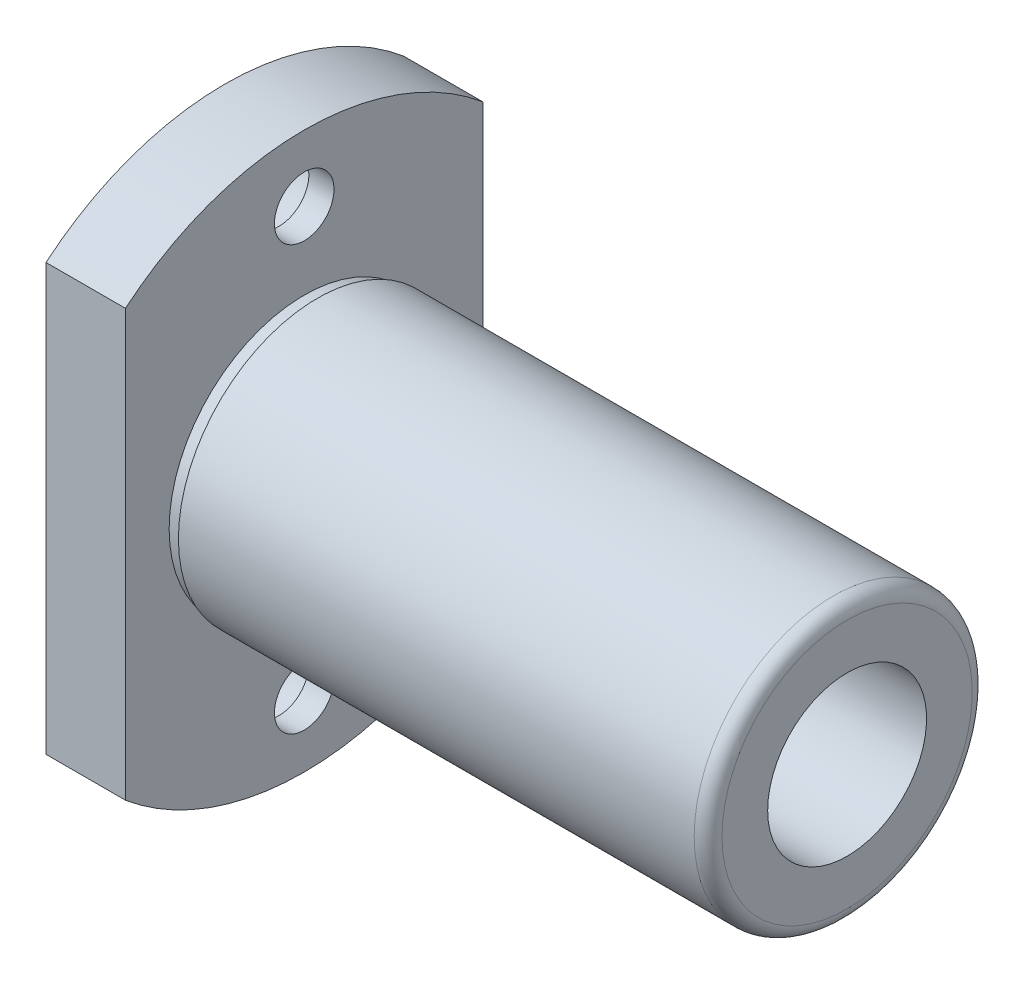
ISO-10303-21;
HEADER;
FILE_DESCRIPTION(('STEP AP214'),'2;1');
FILE_NAME('part.step','',(''),(''),'','','');
FILE_SCHEMA(('AUTOMOTIVE_DESIGN { 1 0 10303 214 1 1 1 1 }'));
ENDSEC;
DATA;
#1=APPLICATION_CONTEXT('core data for automotive mechanical design processes');
#2=APPLICATION_PROTOCOL_DEFINITION('international standard','automotive_design',2000,#1);
#3=PRODUCT_CONTEXT('',#1,'mechanical');
#4=PRODUCT('Part','Part','',(#3));
#5=PRODUCT_RELATED_PRODUCT_CATEGORY('part','',(#4));
#6=PRODUCT_DEFINITION_FORMATION('','',#4);
#7=PRODUCT_DEFINITION_CONTEXT('part definition',#1,'design');
#8=PRODUCT_DEFINITION('design','',#6,#7);
#9=PRODUCT_DEFINITION_SHAPE('','',#8);
#10=(LENGTH_UNIT() NAMED_UNIT(*) SI_UNIT(.MILLI.,.METRE.));
#11=(NAMED_UNIT(*) PLANE_ANGLE_UNIT() SI_UNIT($,.RADIAN.));
#12=(NAMED_UNIT(*) SI_UNIT($,.STERADIAN.) SOLID_ANGLE_UNIT());
#13=UNCERTAINTY_MEASURE_WITH_UNIT(LENGTH_MEASURE(1.E-05),#10,'distance_accuracy_value','');
#14=(GEOMETRIC_REPRESENTATION_CONTEXT(3) GLOBAL_UNCERTAINTY_ASSIGNED_CONTEXT((#13)) GLOBAL_UNIT_ASSIGNED_CONTEXT((#10,
#11,#12)) REPRESENTATION_CONTEXT('',''));
#15=CARTESIAN_POINT('',(0.,0.,0.));
#16=DIRECTION('',(0.,0.,1.));
#17=DIRECTION('',(1.,0.,0.));
#18=AXIS2_PLACEMENT_3D('',#15,#16,#17);
#19=CARTESIAN_POINT('',(0.,21.,0.));
#20=DIRECTION('',(1.,0.,0.));
#21=DIRECTION('',(0.,0.,-1.));
#22=AXIS2_PLACEMENT_3D('',#19,#20,#21);
#23=PLANE('',#22);
#24=CARTESIAN_POINT('',(0.,16.,0.));
#25=DIRECTION('',(-1.,0.,0.));
#26=DIRECTION('',(0.,0.,1.));
#27=AXIS2_PLACEMENT_3D('',#24,#25,#26);
#28=CIRCLE('',#27,3.75);
#29=CARTESIAN_POINT('',(0.,16.,3.75));
#30=VERTEX_POINT('',#29);
#31=EDGE_CURVE('E121',#30,#30,#28,.T.);
#32=ORIENTED_EDGE('',*,*,#31,.F.);
#33=EDGE_LOOP('',(#32));
#34=FACE_BOUND('',#33,.T.);
#35=CARTESIAN_POINT('',(0.,0.,0.));
#36=DIRECTION('',(-1.,0.,0.));
#37=DIRECTION('',(0.,0.,1.));
#38=AXIS2_PLACEMENT_3D('',#35,#36,#37);
#39=CIRCLE('',#38,6.);
#40=CARTESIAN_POINT('',(0.,0.,6.));
#41=VERTEX_POINT('',#40);
#42=EDGE_CURVE('E112',#41,#41,#39,.T.);
#43=ORIENTED_EDGE('',*,*,#42,.F.);
#44=EDGE_LOOP('',(#43));
#45=FACE_BOUND('',#44,.T.);
#46=CARTESIAN_POINT('',(0.,0.,0.));
#47=DIRECTION('',(-1.,0.,0.));
#48=DIRECTION('',(0.,0.,1.));
#49=AXIS2_PLACEMENT_3D('',#46,#47,#48);
#50=CIRCLE('',#49,21.);
#51=CARTESIAN_POINT('',(0.,16.085707942145,13.5));
#52=VERTEX_POINT('',#51);
#53=CARTESIAN_POINT('',(0.,16.085707942145,-13.5));
#54=VERTEX_POINT('',#53);
#55=EDGE_CURVE('E11',#52,#54,#50,.T.);
#56=ORIENTED_EDGE('',*,*,#55,.T.);
#57=DIRECTION('',(0.,1.,0.));
#58=VECTOR('',#57,1.);
#59=CARTESIAN_POINT('',(0.,-16.085707942145,-13.5));
#60=LINE('',#59,#58);
#61=CARTESIAN_POINT('',(0.,-16.085707942145,-13.5));
#62=VERTEX_POINT('',#61);
#63=EDGE_CURVE('E120',#62,#54,#60,.T.);
#64=ORIENTED_EDGE('',*,*,#63,.F.);
#65=CARTESIAN_POINT('',(0.,-16.085707942145,13.5));
#66=VERTEX_POINT('',#65);
#67=EDGE_CURVE('E41',#62,#66,#50,.T.);
#68=ORIENTED_EDGE('',*,*,#67,.T.);
#69=DIRECTION('',(0.,-1.,0.));
#70=VECTOR('',#69,1.);
#71=CARTESIAN_POINT('',(0.,16.085707942145,13.5));
#72=LINE('',#71,#70);
#73=EDGE_CURVE('E81',#52,#66,#72,.T.);
#74=ORIENTED_EDGE('',*,*,#73,.F.);
#75=EDGE_LOOP('',(#56,#64,#68,#74));
#76=FACE_BOUND('',#75,.T.);
#77=CARTESIAN_POINT('',(0.,-16.,0.));
#78=DIRECTION('',(-1.,0.,0.));
#79=DIRECTION('',(0.,0.,1.));
#80=AXIS2_PLACEMENT_3D('',#77,#78,#79);
#81=CIRCLE('',#80,3.75);
#82=CARTESIAN_POINT('',(0.,-16.,3.75));
#83=VERTEX_POINT('',#82);
#84=EDGE_CURVE('E305',#83,#83,#81,.T.);
#85=ORIENTED_EDGE('',*,*,#84,.F.);
#86=EDGE_LOOP('',(#85));
#87=FACE_BOUND('',#86,.T.);
#88=ADVANCED_FACE('F33',(#34,#45,#76,#87),#23,.F.);
#89=CARTESIAN_POINT('',(6.,10.2,0.));
#90=DIRECTION('',(-1.,0.,0.));
#91=DIRECTION('',(0.,0.,1.));
#92=AXIS2_PLACEMENT_3D('',#89,#90,#91);
#93=PLANE('',#92);
#94=CARTESIAN_POINT('',(6.,16.,0.));
#95=DIRECTION('',(-1.,0.,0.));
#96=DIRECTION('',(0.,0.,1.));
#97=AXIS2_PLACEMENT_3D('',#94,#95,#96);
#98=CIRCLE('',#97,2.25);
#99=CARTESIAN_POINT('',(6.,16.,2.25));
#100=VERTEX_POINT('',#99);
#101=EDGE_CURVE('E308',#100,#100,#98,.T.);
#102=ORIENTED_EDGE('',*,*,#101,.T.);
#103=EDGE_LOOP('',(#102));
#104=FACE_BOUND('',#103,.T.);
#105=CARTESIAN_POINT('',(6.,0.,0.));
#106=DIRECTION('',(-1.,0.,0.));
#107=DIRECTION('',(0.,0.,1.));
#108=AXIS2_PLACEMENT_3D('',#105,#106,#107);
#109=CIRCLE('',#108,21.);
#110=CARTESIAN_POINT('',(6.,-16.085707942145,-13.5));
#111=VERTEX_POINT('',#110);
#112=CARTESIAN_POINT('',(6.,-16.0857079421454,13.5));
#113=VERTEX_POINT('',#112);
#114=EDGE_CURVE('E86',#111,#113,#109,.T.);
#115=ORIENTED_EDGE('',*,*,#114,.F.);
#116=DIRECTION('',(0.,1.,0.));
#117=VECTOR('',#116,1.);
#118=CARTESIAN_POINT('',(6.,-16.085707942145,-13.5));
#119=LINE('',#118,#117);
#120=CARTESIAN_POINT('',(6.,16.0857079421452,-13.5000000000002));
#121=VERTEX_POINT('',#120);
#122=EDGE_CURVE('E71',#111,#121,#119,.T.);
#123=ORIENTED_EDGE('',*,*,#122,.T.);
#124=CARTESIAN_POINT('',(6.,16.085707942145,13.5));
#125=VERTEX_POINT('',#124);
#126=EDGE_CURVE('E91',#125,#121,#109,.T.);
#127=ORIENTED_EDGE('',*,*,#126,.F.);
#128=DIRECTION('',(0.,-1.,0.));
#129=VECTOR('',#128,1.);
#130=CARTESIAN_POINT('',(6.,16.085707942145,13.5));
#131=LINE('',#130,#129);
#132=EDGE_CURVE('E80',#125,#113,#131,.T.);
#133=ORIENTED_EDGE('',*,*,#132,.T.);
#134=EDGE_LOOP('',(#115,#123,#127,#133));
#135=FACE_BOUND('',#134,.T.);
#136=CARTESIAN_POINT('',(6.,0.,0.));
#137=DIRECTION('',(-1.,0.,0.));
#138=DIRECTION('',(0.,0.,1.));
#139=AXIS2_PLACEMENT_3D('',#136,#137,#138);
#140=CIRCLE('',#139,10.2);
#141=CARTESIAN_POINT('',(6.,0.,10.2));
#142=VERTEX_POINT('',#141);
#143=EDGE_CURVE('E93',#142,#142,#140,.T.);
#144=ORIENTED_EDGE('',*,*,#143,.T.);
#145=EDGE_LOOP('',(#144));
#146=FACE_BOUND('',#145,.T.);
#147=CARTESIAN_POINT('',(6.,-16.,0.));
#148=DIRECTION('',(-1.,0.,0.));
#149=DIRECTION('',(0.,0.,1.));
#150=AXIS2_PLACEMENT_3D('',#147,#148,#149);
#151=CIRCLE('',#150,2.25);
#152=CARTESIAN_POINT('',(6.,-16.,2.25));
#153=VERTEX_POINT('',#152);
#154=EDGE_CURVE('E297',#153,#153,#151,.T.);
#155=ORIENTED_EDGE('',*,*,#154,.T.);
#156=EDGE_LOOP('',(#155));
#157=FACE_BOUND('',#156,.T.);
#158=ADVANCED_FACE('F89',(#104,#135,#146,#157),#93,.F.);
#159=CARTESIAN_POINT('',(47.,0.,0.));
#160=DIRECTION('',(-1.,0.,0.));
#161=DIRECTION('',(0.,0.,1.));
#162=AXIS2_PLACEMENT_3D('',#159,#160,#161);
#163=CYLINDRICAL_SURFACE('',#162,21.);
#164=ORIENTED_EDGE('',*,*,#126,.T.);
#165=DIRECTION('',(-1.,0.,0.));
#166=VECTOR('',#165,1.);
#167=CARTESIAN_POINT('',(6.,16.085707942145,-13.5));
#168=LINE('',#167,#166);
#169=EDGE_CURVE('E56',#121,#54,#168,.T.);
#170=ORIENTED_EDGE('',*,*,#169,.T.);
#171=ORIENTED_EDGE('',*,*,#55,.F.);
#172=DIRECTION('',(-1.,0.,0.));
#173=VECTOR('',#172,1.);
#174=CARTESIAN_POINT('',(6.,16.085707942145,13.5));
#175=LINE('',#174,#173);
#176=EDGE_CURVE('E130',#125,#52,#175,.T.);
#177=ORIENTED_EDGE('',*,*,#176,.F.);
#178=EDGE_LOOP('',(#164,#170,#171,#177));
#179=FACE_BOUND('',#178,.T.);
#180=ADVANCED_FACE('F132',(#179),#163,.T.);
#181=ORIENTED_EDGE('',*,*,#67,.F.);
#182=DIRECTION('',(-1.,0.,0.));
#183=VECTOR('',#182,1.);
#184=CARTESIAN_POINT('',(6.,-16.085707942145,-13.5));
#185=LINE('',#184,#183);
#186=EDGE_CURVE('E74',#111,#62,#185,.T.);
#187=ORIENTED_EDGE('',*,*,#186,.F.);
#188=ORIENTED_EDGE('',*,*,#114,.T.);
#189=DIRECTION('',(-1.,0.,0.));
#190=VECTOR('',#189,1.);
#191=CARTESIAN_POINT('',(6.,-16.085707942145,13.5));
#192=LINE('',#191,#190);
#193=EDGE_CURVE('E48',#113,#66,#192,.T.);
#194=ORIENTED_EDGE('',*,*,#193,.T.);
#195=EDGE_LOOP('',(#181,#187,#188,#194));
#196=FACE_BOUND('',#195,.T.);
#197=ADVANCED_FACE('F35',(#196),#163,.T.);
#198=CARTESIAN_POINT('',(47.,0.,0.));
#199=DIRECTION('',(-1.,0.,0.));
#200=DIRECTION('',(0.,0.,1.));
#201=AXIS2_PLACEMENT_3D('',#198,#199,#200);
#202=CYLINDRICAL_SURFACE('',#201,6.);
#203=CARTESIAN_POINT('',(47.,0.,0.));
#204=DIRECTION('',(-1.,0.,0.));
#205=DIRECTION('',(0.,0.,1.));
#206=AXIS2_PLACEMENT_3D('',#203,#204,#205);
#207=CIRCLE('',#206,6.);
#208=CARTESIAN_POINT('',(47.,0.,6.));
#209=VERTEX_POINT('',#208);
#210=EDGE_CURVE('E110',#209,#209,#207,.T.);
#211=ORIENTED_EDGE('',*,*,#210,.F.);
#212=EDGE_LOOP('',(#211));
#213=FACE_BOUND('',#212,.T.);
#214=ORIENTED_EDGE('',*,*,#42,.T.);
#215=EDGE_LOOP('',(#214));
#216=FACE_BOUND('',#215,.T.);
#217=ADVANCED_FACE('F158',(#213,#216),#202,.F.);
#218=CARTESIAN_POINT('',(47.,6.,0.));
#219=DIRECTION('',(-1.,0.,0.));
#220=DIRECTION('',(0.,0.,1.));
#221=AXIS2_PLACEMENT_3D('',#218,#219,#220);
#222=PLANE('',#221);
#223=CARTESIAN_POINT('',(47.,0.,0.));
#224=DIRECTION('',(-1.,0.,0.));
#225=DIRECTION('',(0.,0.,1.));
#226=AXIS2_PLACEMENT_3D('',#223,#224,#225);
#227=CIRCLE('',#226,9.45);
#228=CARTESIAN_POINT('',(47.,0.,9.45));
#229=VERTEX_POINT('',#228);
#230=EDGE_CURVE('E107',#229,#229,#227,.T.);
#231=ORIENTED_EDGE('',*,*,#230,.F.);
#232=EDGE_LOOP('',(#231));
#233=FACE_BOUND('',#232,.T.);
#234=ORIENTED_EDGE('',*,*,#210,.T.);
#235=EDGE_LOOP('',(#234));
#236=FACE_BOUND('',#235,.T.);
#237=ADVANCED_FACE('F161',(#233,#236),#222,.F.);
#238=CARTESIAN_POINT('',(45.9500000000004,0.,0.));
#239=DIRECTION('',(-1.,0.,0.));
#240=DIRECTION('',(0.,0.,1.));
#241=AXIS2_PLACEMENT_3D('',#238,#239,#240);
#242=TOROIDAL_SURFACE('',#241,9.45000000000042,1.04999999999957);
#243=CARTESIAN_POINT('',(45.95,0.,0.));
#244=DIRECTION('',(-1.,0.,0.));
#245=DIRECTION('',(0.,0.,1.));
#246=AXIS2_PLACEMENT_3D('',#243,#244,#245);
#247=CIRCLE('',#246,10.5);
#248=CARTESIAN_POINT('',(45.95,0.,10.5));
#249=VERTEX_POINT('',#248);
#250=EDGE_CURVE('E104',#249,#249,#247,.T.);
#251=ORIENTED_EDGE('',*,*,#250,.F.);
#252=EDGE_LOOP('',(#251));
#253=FACE_BOUND('',#252,.T.);
#254=ORIENTED_EDGE('',*,*,#230,.T.);
#255=EDGE_LOOP('',(#254));
#256=FACE_BOUND('',#255,.T.);
#257=ADVANCED_FACE('F165',(#253,#256),#242,.T.);
#258=CARTESIAN_POINT('',(47.,0.,0.));
#259=DIRECTION('',(-1.,0.,0.));
#260=DIRECTION('',(0.,0.,1.));
#261=AXIS2_PLACEMENT_3D('',#258,#259,#260);
#262=CYLINDRICAL_SURFACE('',#261,10.5);
#263=CARTESIAN_POINT('',(7.,0.,0.));
#264=DIRECTION('',(-1.,0.,0.));
#265=DIRECTION('',(0.,0.,1.));
#266=AXIS2_PLACEMENT_3D('',#263,#264,#265);
#267=CIRCLE('',#266,10.5);
#268=CARTESIAN_POINT('',(7.,0.,10.5));
#269=VERTEX_POINT('',#268);
#270=EDGE_CURVE('E101',#269,#269,#267,.T.);
#271=ORIENTED_EDGE('',*,*,#270,.F.);
#272=EDGE_LOOP('',(#271));
#273=FACE_BOUND('',#272,.T.);
#274=ORIENTED_EDGE('',*,*,#250,.T.);
#275=EDGE_LOOP('',(#274));
#276=FACE_BOUND('',#275,.T.);
#277=ADVANCED_FACE('F169',(#273,#276),#262,.T.);
#278=CARTESIAN_POINT('',(7.,10.5,0.));
#279=DIRECTION('',(1.,0.,0.));
#280=DIRECTION('',(0.,0.,-1.));
#281=AXIS2_PLACEMENT_3D('',#278,#279,#280);
#282=PLANE('',#281);
#283=CARTESIAN_POINT('',(7.,0.,0.));
#284=DIRECTION('',(-1.,0.,0.));
#285=DIRECTION('',(0.,0.,1.));
#286=AXIS2_PLACEMENT_3D('',#283,#284,#285);
#287=CIRCLE('',#286,10.2);
#288=CARTESIAN_POINT('',(7.,0.,10.2));
#289=VERTEX_POINT('',#288);
#290=EDGE_CURVE('E98',#289,#289,#287,.T.);
#291=ORIENTED_EDGE('',*,*,#290,.F.);
#292=EDGE_LOOP('',(#291));
#293=FACE_BOUND('',#292,.T.);
#294=ORIENTED_EDGE('',*,*,#270,.T.);
#295=EDGE_LOOP('',(#294));
#296=FACE_BOUND('',#295,.T.);
#297=ADVANCED_FACE('F144',(#293,#296),#282,.F.);
#298=CARTESIAN_POINT('',(47.,0.,0.));
#299=DIRECTION('',(-1.,0.,0.));
#300=DIRECTION('',(0.,0.,1.));
#301=AXIS2_PLACEMENT_3D('',#298,#299,#300);
#302=CYLINDRICAL_SURFACE('',#301,10.2);
#303=ORIENTED_EDGE('',*,*,#143,.F.);
#304=EDGE_LOOP('',(#303));
#305=FACE_BOUND('',#304,.T.);
#306=ORIENTED_EDGE('',*,*,#290,.T.);
#307=EDGE_LOOP('',(#306));
#308=FACE_BOUND('',#307,.T.);
#309=ADVANCED_FACE('F136',(#305,#308),#302,.T.);
#310=CARTESIAN_POINT('',(6.,16.085707942145,13.5));
#311=DIRECTION('',(0.,0.,-1.));
#312=DIRECTION('',(-1.,0.,0.));
#313=AXIS2_PLACEMENT_3D('',#310,#311,#312);
#314=PLANE('',#313);
#315=ORIENTED_EDGE('',*,*,#73,.T.);
#316=ORIENTED_EDGE('',*,*,#193,.F.);
#317=ORIENTED_EDGE('',*,*,#132,.F.);
#318=ORIENTED_EDGE('',*,*,#176,.T.);
#319=EDGE_LOOP('',(#315,#316,#317,#318));
#320=FACE_BOUND('',#319,.T.);
#321=ADVANCED_FACE('F134',(#320),#314,.F.);
#322=CARTESIAN_POINT('',(6.,-16.085707942145,-13.5));
#323=DIRECTION('',(0.,0.,1.));
#324=DIRECTION('',(1.,0.,0.));
#325=AXIS2_PLACEMENT_3D('',#322,#323,#324);
#326=PLANE('',#325);
#327=ORIENTED_EDGE('',*,*,#63,.T.);
#328=ORIENTED_EDGE('',*,*,#169,.F.);
#329=ORIENTED_EDGE('',*,*,#122,.F.);
#330=ORIENTED_EDGE('',*,*,#186,.T.);
#331=EDGE_LOOP('',(#327,#328,#329,#330));
#332=FACE_BOUND('',#331,.T.);
#333=ADVANCED_FACE('F73',(#332),#326,.F.);
#334=CARTESIAN_POINT('',(6.,16.,0.));
#335=DIRECTION('',(-1.,0.,0.));
#336=DIRECTION('',(0.,0.,1.));
#337=AXIS2_PLACEMENT_3D('',#334,#335,#336);
#338=CYLINDRICAL_SURFACE('',#337,3.75);
#339=ORIENTED_EDGE('',*,*,#31,.T.);
#340=EDGE_LOOP('',(#339));
#341=FACE_BOUND('',#340,.T.);
#342=CARTESIAN_POINT('',(4.1,16.,0.));
#343=DIRECTION('',(-1.,0.,0.));
#344=DIRECTION('',(0.,0.,1.));
#345=AXIS2_PLACEMENT_3D('',#342,#343,#344);
#346=CIRCLE('',#345,3.75);
#347=CARTESIAN_POINT('',(4.1,16.,3.75));
#348=VERTEX_POINT('',#347);
#349=EDGE_CURVE('E125',#348,#348,#346,.T.);
#350=ORIENTED_EDGE('',*,*,#349,.F.);
#351=EDGE_LOOP('',(#350));
#352=FACE_BOUND('',#351,.T.);
#353=ADVANCED_FACE('F142',(#341,#352),#338,.F.);
#354=CARTESIAN_POINT('',(4.1,19.75,0.));
#355=DIRECTION('',(-1.,0.,0.));
#356=DIRECTION('',(0.,0.,1.));
#357=AXIS2_PLACEMENT_3D('',#354,#355,#356);
#358=PLANE('',#357);
#359=ORIENTED_EDGE('',*,*,#349,.T.);
#360=EDGE_LOOP('',(#359));
#361=FACE_BOUND('',#360,.T.);
#362=CARTESIAN_POINT('',(4.1,16.,0.));
#363=DIRECTION('',(-1.,0.,0.));
#364=DIRECTION('',(0.,0.,1.));
#365=AXIS2_PLACEMENT_3D('',#362,#363,#364);
#366=CIRCLE('',#365,2.25);
#367=CARTESIAN_POINT('',(4.1,16.,2.25));
#368=VERTEX_POINT('',#367);
#369=EDGE_CURVE('E311',#368,#368,#366,.T.);
#370=ORIENTED_EDGE('',*,*,#369,.F.);
#371=EDGE_LOOP('',(#370));
#372=FACE_BOUND('',#371,.T.);
#373=ADVANCED_FACE('F228',(#361,#372),#358,.T.);
#374=CARTESIAN_POINT('',(6.,16.,0.));
#375=DIRECTION('',(-1.,0.,0.));
#376=DIRECTION('',(0.,0.,1.));
#377=AXIS2_PLACEMENT_3D('',#374,#375,#376);
#378=CYLINDRICAL_SURFACE('',#377,2.25);
#379=ORIENTED_EDGE('',*,*,#369,.T.);
#380=EDGE_LOOP('',(#379));
#381=FACE_BOUND('',#380,.T.);
#382=ORIENTED_EDGE('',*,*,#101,.F.);
#383=EDGE_LOOP('',(#382));
#384=FACE_BOUND('',#383,.T.);
#385=ADVANCED_FACE('F237',(#381,#384),#378,.F.);
#386=CARTESIAN_POINT('',(6.,-16.,0.));
#387=DIRECTION('',(-1.,0.,0.));
#388=DIRECTION('',(0.,0.,1.));
#389=AXIS2_PLACEMENT_3D('',#386,#387,#388);
#390=CYLINDRICAL_SURFACE('',#389,3.75);
#391=ORIENTED_EDGE('',*,*,#84,.T.);
#392=EDGE_LOOP('',(#391));
#393=FACE_BOUND('',#392,.T.);
#394=CARTESIAN_POINT('',(4.1,-16.,0.));
#395=DIRECTION('',(-1.,0.,0.));
#396=DIRECTION('',(0.,0.,1.));
#397=AXIS2_PLACEMENT_3D('',#394,#395,#396);
#398=CIRCLE('',#397,3.75);
#399=CARTESIAN_POINT('',(4.1,-16.,3.75));
#400=VERTEX_POINT('',#399);
#401=EDGE_CURVE('E300',#400,#400,#398,.T.);
#402=ORIENTED_EDGE('',*,*,#401,.F.);
#403=EDGE_LOOP('',(#402));
#404=FACE_BOUND('',#403,.T.);
#405=ADVANCED_FACE('F246',(#393,#404),#390,.F.);
#406=CARTESIAN_POINT('',(4.1,-12.25,0.));
#407=DIRECTION('',(-1.,0.,0.));
#408=DIRECTION('',(0.,0.,1.));
#409=AXIS2_PLACEMENT_3D('',#406,#407,#408);
#410=PLANE('',#409);
#411=ORIENTED_EDGE('',*,*,#401,.T.);
#412=EDGE_LOOP('',(#411));
#413=FACE_BOUND('',#412,.T.);
#414=CARTESIAN_POINT('',(4.1,-16.,0.));
#415=DIRECTION('',(-1.,0.,0.));
#416=DIRECTION('',(0.,0.,1.));
#417=AXIS2_PLACEMENT_3D('',#414,#415,#416);
#418=CIRCLE('',#417,2.25);
#419=CARTESIAN_POINT('',(4.1,-16.,2.25));
#420=VERTEX_POINT('',#419);
#421=EDGE_CURVE('E294',#420,#420,#418,.T.);
#422=ORIENTED_EDGE('',*,*,#421,.F.);
#423=EDGE_LOOP('',(#422));
#424=FACE_BOUND('',#423,.T.);
#425=ADVANCED_FACE('F267',(#413,#424),#410,.T.);
#426=CARTESIAN_POINT('',(6.,-16.,0.));
#427=DIRECTION('',(-1.,0.,0.));
#428=DIRECTION('',(0.,0.,1.));
#429=AXIS2_PLACEMENT_3D('',#426,#427,#428);
#430=CYLINDRICAL_SURFACE('',#429,2.25);
#431=ORIENTED_EDGE('',*,*,#421,.T.);
#432=EDGE_LOOP('',(#431));
#433=FACE_BOUND('',#432,.T.);
#434=ORIENTED_EDGE('',*,*,#154,.F.);
#435=EDGE_LOOP('',(#434));
#436=FACE_BOUND('',#435,.T.);
#437=ADVANCED_FACE('F277',(#433,#436),#430,.F.);
#438=CLOSED_SHELL('',(#88,#158,#180,#197,#217,#237,#257,#277,#297,#309,#321,#333,#353,#373,#385,
#405,#425,#437));
#439=MANIFOLD_SOLID_BREP('B2',#438);
#440=ADVANCED_BREP_SHAPE_REPRESENTATION('',(#18,#439),#14);
#441=SHAPE_DEFINITION_REPRESENTATION(#9,#440);
ENDSEC;
END-ISO-10303-21;
